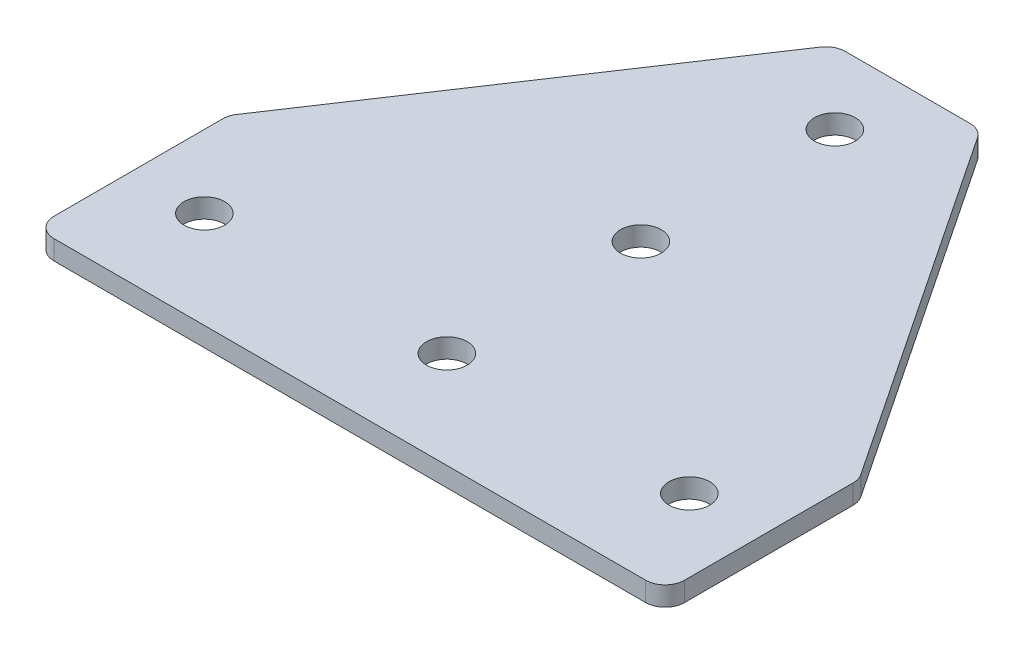
ISO-10303-21;
HEADER;
FILE_DESCRIPTION(('STEP AP214'),'2;1');
FILE_NAME('part.step','',(''),(''),'','','');
FILE_SCHEMA(('AUTOMOTIVE_DESIGN { 1 0 10303 214 1 1 1 1 }'));
ENDSEC;
DATA;
#1=APPLICATION_CONTEXT('core data for automotive mechanical design processes');
#2=APPLICATION_PROTOCOL_DEFINITION('international standard','automotive_design',2000,#1);
#3=PRODUCT_CONTEXT('',#1,'mechanical');
#4=PRODUCT('Part','Part','',(#3));
#5=PRODUCT_RELATED_PRODUCT_CATEGORY('part','',(#4));
#6=PRODUCT_DEFINITION_FORMATION('','',#4);
#7=PRODUCT_DEFINITION_CONTEXT('part definition',#1,'design');
#8=PRODUCT_DEFINITION('design','',#6,#7);
#9=PRODUCT_DEFINITION_SHAPE('','',#8);
#10=(LENGTH_UNIT() NAMED_UNIT(*) SI_UNIT(.MILLI.,.METRE.));
#11=(NAMED_UNIT(*) PLANE_ANGLE_UNIT() SI_UNIT($,.RADIAN.));
#12=(NAMED_UNIT(*) SI_UNIT($,.STERADIAN.) SOLID_ANGLE_UNIT());
#13=UNCERTAINTY_MEASURE_WITH_UNIT(LENGTH_MEASURE(1.E-05),#10,'distance_accuracy_value','');
#14=(GEOMETRIC_REPRESENTATION_CONTEXT(3) GLOBAL_UNCERTAINTY_ASSIGNED_CONTEXT((#13)) GLOBAL_UNIT_ASSIGNED_CONTEXT((#10,
#11,#12)) REPRESENTATION_CONTEXT('',''));
#15=CARTESIAN_POINT('',(0.,0.,0.));
#16=DIRECTION('',(0.,0.,1.));
#17=DIRECTION('',(1.,0.,0.));
#18=AXIS2_PLACEMENT_3D('',#15,#16,#17);
#19=CARTESIAN_POINT('',(0.,2.,0.));
#20=DIRECTION('',(0.,1.,0.));
#21=DIRECTION('',(0.,0.,1.));
#22=AXIS2_PLACEMENT_3D('',#19,#20,#21);
#23=PLANE('',#22);
#24=CARTESIAN_POINT('',(32.5,2.,-50.));
#25=DIRECTION('',(0.,1.,0.));
#26=DIRECTION('',(0.,0.,1.));
#27=AXIS2_PLACEMENT_3D('',#24,#25,#26);
#28=CIRCLE('',#27,2.1);
#29=CARTESIAN_POINT('',(32.5,2.,-47.9));
#30=VERTEX_POINT('',#29);
#31=EDGE_CURVE('E250',#30,#30,#28,.T.);
#32=ORIENTED_EDGE('',*,*,#31,.F.);
#33=EDGE_LOOP('',(#32));
#34=FACE_BOUND('',#33,.T.);
#35=CARTESIAN_POINT('',(57.5,2.,-10.));
#36=DIRECTION('',(0.,1.,0.));
#37=DIRECTION('',(0.,0.,-1.));
#38=AXIS2_PLACEMENT_3D('',#35,#36,#37);
#39=CIRCLE('',#38,2.1);
#40=CARTESIAN_POINT('',(57.5,2.,-12.1));
#41=VERTEX_POINT('',#40);
#42=EDGE_CURVE('E239',#41,#41,#39,.T.);
#43=ORIENTED_EDGE('',*,*,#42,.F.);
#44=EDGE_LOOP('',(#43));
#45=FACE_BOUND('',#44,.T.);
#46=DIRECTION('',(-0.554700196225229,0.,0.832050294337844));
#47=VECTOR('',#46,1.);
#48=CARTESIAN_POINT('',(25.,2.,-57.5));
#49=LINE('',#48,#47);
#50=CARTESIAN_POINT('',(24.4062669283003,2.,-56.6094003924505));
#51=VERTEX_POINT('',#50);
#52=CARTESIAN_POINT('',(0.335899411324305,2.,-20.5038491169865));
#53=VERTEX_POINT('',#52);
#54=EDGE_CURVE('E162',#51,#53,#49,.T.);
#55=ORIENTED_EDGE('',*,*,#54,.T.);
#56=CARTESIAN_POINT('',(2.,2.,-19.394448724536));
#57=DIRECTION('',(0.,1.,0.));
#58=DIRECTION('',(0.,0.,1.));
#59=AXIS2_PLACEMENT_3D('',#56,#57,#58);
#60=CIRCLE('',#59,2.);
#61=CARTESIAN_POINT('',(0.,2.,-19.394448724536));
#62=VERTEX_POINT('',#61);
#63=EDGE_CURVE('E195',#53,#62,#60,.T.);
#64=ORIENTED_EDGE('',*,*,#63,.T.);
#65=DIRECTION('',(0.,0.,1.));
#66=VECTOR('',#65,1.);
#67=CARTESIAN_POINT('',(0.,2.,-20.));
#68=LINE('',#67,#66);
#69=CARTESIAN_POINT('',(0.,2.,-2.));
#70=VERTEX_POINT('',#69);
#71=EDGE_CURVE('E145',#62,#70,#68,.T.);
#72=ORIENTED_EDGE('',*,*,#71,.T.);
#73=CARTESIAN_POINT('',(2.,2.,-2.));
#74=DIRECTION('',(0.,1.,0.));
#75=DIRECTION('',(0.,0.,1.));
#76=AXIS2_PLACEMENT_3D('',#73,#74,#75);
#77=CIRCLE('',#76,2.);
#78=CARTESIAN_POINT('',(2.,2.,0.));
#79=VERTEX_POINT('',#78);
#80=EDGE_CURVE('E193',#70,#79,#77,.T.);
#81=ORIENTED_EDGE('',*,*,#80,.T.);
#82=DIRECTION('',(1.,0.,0.));
#83=VECTOR('',#82,1.);
#84=CARTESIAN_POINT('',(0.,2.,0.));
#85=LINE('',#84,#83);
#86=CARTESIAN_POINT('',(63.,2.,0.));
#87=VERTEX_POINT('',#86);
#88=EDGE_CURVE('E234',#79,#87,#85,.T.);
#89=ORIENTED_EDGE('',*,*,#88,.T.);
#90=CARTESIAN_POINT('',(63.,2.,-2.));
#91=DIRECTION('',(0.,1.,0.));
#92=DIRECTION('',(0.,0.,1.));
#93=AXIS2_PLACEMENT_3D('',#90,#91,#92);
#94=CIRCLE('',#93,2.);
#95=CARTESIAN_POINT('',(65.,2.,-2.));
#96=VERTEX_POINT('',#95);
#97=EDGE_CURVE('E191',#87,#96,#94,.T.);
#98=ORIENTED_EDGE('',*,*,#97,.T.);
#99=DIRECTION('',(0.,0.,-1.));
#100=VECTOR('',#99,1.);
#101=CARTESIAN_POINT('',(65.,2.,0.));
#102=LINE('',#101,#100);
#103=CARTESIAN_POINT('',(65.,2.,-19.394448724536));
#104=VERTEX_POINT('',#103);
#105=EDGE_CURVE('E229',#96,#104,#102,.T.);
#106=ORIENTED_EDGE('',*,*,#105,.T.);
#107=CARTESIAN_POINT('',(63.,2.,-19.394448724536));
#108=DIRECTION('',(0.,1.,0.));
#109=DIRECTION('',(0.,0.,1.));
#110=AXIS2_PLACEMENT_3D('',#107,#108,#109);
#111=CIRCLE('',#110,2.);
#112=CARTESIAN_POINT('',(64.6641005886757,2.,-20.5038491169865));
#113=VERTEX_POINT('',#112);
#114=EDGE_CURVE('E189',#104,#113,#111,.T.);
#115=ORIENTED_EDGE('',*,*,#114,.T.);
#116=DIRECTION('',(-0.554700196225229,0.,-0.832050294337844));
#117=VECTOR('',#116,1.);
#118=CARTESIAN_POINT('',(65.,2.,-20.));
#119=LINE('',#118,#117);
#120=CARTESIAN_POINT('',(40.5937330716997,2.,-56.6094003924505));
#121=VERTEX_POINT('',#120);
#122=EDGE_CURVE('E217',#113,#121,#119,.T.);
#123=ORIENTED_EDGE('',*,*,#122,.T.);
#124=CARTESIAN_POINT('',(38.929632483024,2.,-55.5));
#125=DIRECTION('',(0.,1.,0.));
#126=DIRECTION('',(0.,0.,1.));
#127=AXIS2_PLACEMENT_3D('',#124,#125,#126);
#128=CIRCLE('',#127,2.);
#129=CARTESIAN_POINT('',(38.929632483024,2.,-57.5));
#130=VERTEX_POINT('',#129);
#131=EDGE_CURVE('E56',#121,#130,#128,.T.);
#132=ORIENTED_EDGE('',*,*,#131,.T.);
#133=DIRECTION('',(-1.,0.,0.));
#134=VECTOR('',#133,1.);
#135=CARTESIAN_POINT('',(40.,2.,-57.5));
#136=LINE('',#135,#134);
#137=CARTESIAN_POINT('',(26.070367516976,2.,-57.5));
#138=VERTEX_POINT('',#137);
#139=EDGE_CURVE('E226',#130,#138,#136,.T.);
#140=ORIENTED_EDGE('',*,*,#139,.T.);
#141=CARTESIAN_POINT('',(26.070367516976,2.,-55.5));
#142=DIRECTION('',(0.,1.,0.));
#143=DIRECTION('',(0.,0.,1.));
#144=AXIS2_PLACEMENT_3D('',#141,#142,#143);
#145=CIRCLE('',#144,2.);
#146=EDGE_CURVE('E186',#138,#51,#145,.T.);
#147=ORIENTED_EDGE('',*,*,#146,.T.);
#148=EDGE_LOOP('',(#55,#64,#72,#81,#89,#98,#106,#115,#123,#132,#140,#147));
#149=FACE_BOUND('',#148,.T.);
#150=CARTESIAN_POINT('',(7.5,2.,-10.));
#151=DIRECTION('',(0.,1.,0.));
#152=DIRECTION('',(0.,0.,1.));
#153=AXIS2_PLACEMENT_3D('',#150,#151,#152);
#154=CIRCLE('',#153,2.1);
#155=CARTESIAN_POINT('',(7.5,2.,-7.9));
#156=VERTEX_POINT('',#155);
#157=EDGE_CURVE('E153',#156,#156,#154,.T.);
#158=ORIENTED_EDGE('',*,*,#157,.F.);
#159=EDGE_LOOP('',(#158));
#160=FACE_BOUND('',#159,.T.);
#161=CARTESIAN_POINT('',(32.5,2.,-10.));
#162=DIRECTION('',(0.,1.,0.));
#163=DIRECTION('',(0.,0.,1.));
#164=AXIS2_PLACEMENT_3D('',#161,#162,#163);
#165=CIRCLE('',#164,2.1);
#166=CARTESIAN_POINT('',(32.5,2.,-7.9));
#167=VERTEX_POINT('',#166);
#168=EDGE_CURVE('E244',#167,#167,#165,.T.);
#169=ORIENTED_EDGE('',*,*,#168,.F.);
#170=EDGE_LOOP('',(#169));
#171=FACE_BOUND('',#170,.T.);
#172=CARTESIAN_POINT('',(32.5,2.,-30.));
#173=DIRECTION('',(0.,1.,0.));
#174=DIRECTION('',(0.,0.,1.));
#175=AXIS2_PLACEMENT_3D('',#172,#173,#174);
#176=CIRCLE('',#175,2.1);
#177=CARTESIAN_POINT('',(32.5,2.,-27.9));
#178=VERTEX_POINT('',#177);
#179=EDGE_CURVE('E256',#178,#178,#176,.T.);
#180=ORIENTED_EDGE('',*,*,#179,.F.);
#181=EDGE_LOOP('',(#180));
#182=FACE_BOUND('',#181,.T.);
#183=ADVANCED_FACE('F35',(#34,#45,#149,#160,#171,#182),#23,.T.);
#184=CARTESIAN_POINT('',(0.,0.,0.));
#185=DIRECTION('',(0.,1.,0.));
#186=DIRECTION('',(0.,0.,1.));
#187=AXIS2_PLACEMENT_3D('',#184,#185,#186);
#188=PLANE('',#187);
#189=DIRECTION('',(0.,0.,1.));
#190=VECTOR('',#189,1.);
#191=CARTESIAN_POINT('',(0.,0.,-20.));
#192=LINE('',#191,#190);
#193=CARTESIAN_POINT('',(0.,0.,-19.394448724536));
#194=VERTEX_POINT('',#193);
#195=CARTESIAN_POINT('',(0.,0.,-2.));
#196=VERTEX_POINT('',#195);
#197=EDGE_CURVE('E142',#194,#196,#192,.T.);
#198=ORIENTED_EDGE('',*,*,#197,.F.);
#199=CARTESIAN_POINT('',(2.,0.,-19.394448724536));
#200=DIRECTION('',(0.,1.,0.));
#201=DIRECTION('',(0.,0.,1.));
#202=AXIS2_PLACEMENT_3D('',#199,#200,#201);
#203=CIRCLE('',#202,2.);
#204=CARTESIAN_POINT('',(0.335899411324305,0.,-20.5038491169865));
#205=VERTEX_POINT('',#204);
#206=EDGE_CURVE('E125',#194,#205,#203,.F.);
#207=ORIENTED_EDGE('',*,*,#206,.T.);
#208=DIRECTION('',(-0.554700196225229,0.,0.832050294337844));
#209=VECTOR('',#208,1.);
#210=CARTESIAN_POINT('',(25.,0.,-57.5));
#211=LINE('',#210,#209);
#212=CARTESIAN_POINT('',(24.4062669283003,0.,-56.6094003924505));
#213=VERTEX_POINT('',#212);
#214=EDGE_CURVE('E172',#213,#205,#211,.T.);
#215=ORIENTED_EDGE('',*,*,#214,.F.);
#216=CARTESIAN_POINT('',(26.070367516976,0.,-55.5));
#217=DIRECTION('',(0.,1.,0.));
#218=DIRECTION('',(0.,0.,1.));
#219=AXIS2_PLACEMENT_3D('',#216,#217,#218);
#220=CIRCLE('',#219,2.);
#221=CARTESIAN_POINT('',(26.070367516976,0.,-57.5));
#222=VERTEX_POINT('',#221);
#223=EDGE_CURVE('E146',#213,#222,#220,.F.);
#224=ORIENTED_EDGE('',*,*,#223,.T.);
#225=DIRECTION('',(-1.,0.,0.));
#226=VECTOR('',#225,1.);
#227=CARTESIAN_POINT('',(40.,0.,-57.5));
#228=LINE('',#227,#226);
#229=CARTESIAN_POINT('',(38.929632483024,0.,-57.5));
#230=VERTEX_POINT('',#229);
#231=EDGE_CURVE('E170',#230,#222,#228,.T.);
#232=ORIENTED_EDGE('',*,*,#231,.F.);
#233=CARTESIAN_POINT('',(38.929632483024,0.,-55.5));
#234=DIRECTION('',(0.,1.,0.));
#235=DIRECTION('',(0.,0.,1.));
#236=AXIS2_PLACEMENT_3D('',#233,#234,#235);
#237=CIRCLE('',#236,2.);
#238=CARTESIAN_POINT('',(40.5937330716997,0.,-56.6094003924505));
#239=VERTEX_POINT('',#238);
#240=EDGE_CURVE('E176',#230,#239,#237,.F.);
#241=ORIENTED_EDGE('',*,*,#240,.T.);
#242=DIRECTION('',(-0.554700196225229,0.,-0.832050294337844));
#243=VECTOR('',#242,1.);
#244=CARTESIAN_POINT('',(65.,0.,-20.));
#245=LINE('',#244,#243);
#246=CARTESIAN_POINT('',(64.6641005886757,0.,-20.5038491169865));
#247=VERTEX_POINT('',#246);
#248=EDGE_CURVE('E167',#247,#239,#245,.T.);
#249=ORIENTED_EDGE('',*,*,#248,.F.);
#250=CARTESIAN_POINT('',(63.,0.,-19.394448724536));
#251=DIRECTION('',(0.,1.,0.));
#252=DIRECTION('',(0.,0.,1.));
#253=AXIS2_PLACEMENT_3D('',#250,#251,#252);
#254=CIRCLE('',#253,2.);
#255=CARTESIAN_POINT('',(65.,0.,-19.394448724536));
#256=VERTEX_POINT('',#255);
#257=EDGE_CURVE('E178',#247,#256,#254,.F.);
#258=ORIENTED_EDGE('',*,*,#257,.T.);
#259=DIRECTION('',(0.,0.,-1.));
#260=VECTOR('',#259,1.);
#261=CARTESIAN_POINT('',(65.,0.,0.));
#262=LINE('',#261,#260);
#263=CARTESIAN_POINT('',(65.,0.,-2.));
#264=VERTEX_POINT('',#263);
#265=EDGE_CURVE('E156',#264,#256,#262,.T.);
#266=ORIENTED_EDGE('',*,*,#265,.F.);
#267=CARTESIAN_POINT('',(63.,0.,-2.));
#268=DIRECTION('',(0.,1.,0.));
#269=DIRECTION('',(0.,0.,1.));
#270=AXIS2_PLACEMENT_3D('',#267,#268,#269);
#271=CIRCLE('',#270,2.);
#272=CARTESIAN_POINT('',(63.,0.,0.));
#273=VERTEX_POINT('',#272);
#274=EDGE_CURVE('E180',#264,#273,#271,.F.);
#275=ORIENTED_EDGE('',*,*,#274,.T.);
#276=DIRECTION('',(1.,0.,0.));
#277=VECTOR('',#276,1.);
#278=CARTESIAN_POINT('',(0.,0.,0.));
#279=LINE('',#278,#277);
#280=CARTESIAN_POINT('',(2.,0.,0.));
#281=VERTEX_POINT('',#280);
#282=EDGE_CURVE('E152',#281,#273,#279,.T.);
#283=ORIENTED_EDGE('',*,*,#282,.F.);
#284=CARTESIAN_POINT('',(2.,0.,-2.));
#285=DIRECTION('',(0.,1.,0.));
#286=DIRECTION('',(0.,0.,1.));
#287=AXIS2_PLACEMENT_3D('',#284,#285,#286);
#288=CIRCLE('',#287,2.);
#289=EDGE_CURVE('E136',#281,#196,#288,.F.);
#290=ORIENTED_EDGE('',*,*,#289,.T.);
#291=EDGE_LOOP('',(#198,#207,#215,#224,#232,#241,#249,#258,#266,#275,#283,#290));
#292=FACE_BOUND('',#291,.T.);
#293=CARTESIAN_POINT('',(7.5,0.,-10.));
#294=DIRECTION('',(0.,1.,0.));
#295=DIRECTION('',(0.,0.,1.));
#296=AXIS2_PLACEMENT_3D('',#293,#294,#295);
#297=CIRCLE('',#296,2.1);
#298=CARTESIAN_POINT('',(7.5,0.,-7.9));
#299=VERTEX_POINT('',#298);
#300=EDGE_CURVE('E159',#299,#299,#297,.T.);
#301=ORIENTED_EDGE('',*,*,#300,.T.);
#302=EDGE_LOOP('',(#301));
#303=FACE_BOUND('',#302,.T.);
#304=CARTESIAN_POINT('',(57.5,0.,-10.));
#305=DIRECTION('',(0.,1.,0.));
#306=DIRECTION('',(0.,0.,-1.));
#307=AXIS2_PLACEMENT_3D('',#304,#305,#306);
#308=CIRCLE('',#307,2.1);
#309=CARTESIAN_POINT('',(57.5,0.,-12.1));
#310=VERTEX_POINT('',#309);
#311=EDGE_CURVE('E241',#310,#310,#308,.T.);
#312=ORIENTED_EDGE('',*,*,#311,.T.);
#313=EDGE_LOOP('',(#312));
#314=FACE_BOUND('',#313,.T.);
#315=CARTESIAN_POINT('',(32.5,0.,-10.));
#316=DIRECTION('',(0.,1.,0.));
#317=DIRECTION('',(0.,0.,1.));
#318=AXIS2_PLACEMENT_3D('',#315,#316,#317);
#319=CIRCLE('',#318,2.1);
#320=CARTESIAN_POINT('',(32.5,0.,-7.9));
#321=VERTEX_POINT('',#320);
#322=EDGE_CURVE('E247',#321,#321,#319,.T.);
#323=ORIENTED_EDGE('',*,*,#322,.T.);
#324=EDGE_LOOP('',(#323));
#325=FACE_BOUND('',#324,.T.);
#326=CARTESIAN_POINT('',(32.5,0.,-50.));
#327=DIRECTION('',(0.,1.,0.));
#328=DIRECTION('',(0.,0.,1.));
#329=AXIS2_PLACEMENT_3D('',#326,#327,#328);
#330=CIRCLE('',#329,2.1);
#331=CARTESIAN_POINT('',(32.5,0.,-47.9));
#332=VERTEX_POINT('',#331);
#333=EDGE_CURVE('E253',#332,#332,#330,.T.);
#334=ORIENTED_EDGE('',*,*,#333,.T.);
#335=EDGE_LOOP('',(#334));
#336=FACE_BOUND('',#335,.T.);
#337=CARTESIAN_POINT('',(32.5,0.,-30.));
#338=DIRECTION('',(0.,1.,0.));
#339=DIRECTION('',(0.,0.,1.));
#340=AXIS2_PLACEMENT_3D('',#337,#338,#339);
#341=CIRCLE('',#340,2.1);
#342=CARTESIAN_POINT('',(32.5,0.,-27.9));
#343=VERTEX_POINT('',#342);
#344=EDGE_CURVE('E259',#343,#343,#341,.T.);
#345=ORIENTED_EDGE('',*,*,#344,.T.);
#346=EDGE_LOOP('',(#345));
#347=FACE_BOUND('',#346,.T.);
#348=ADVANCED_FACE('F149',(#292,#303,#314,#325,#336,#347),#188,.F.);
#349=CARTESIAN_POINT('',(0.,2.,-20.));
#350=DIRECTION('',(1.,0.,0.));
#351=DIRECTION('',(0.,0.,-1.));
#352=AXIS2_PLACEMENT_3D('',#349,#350,#351);
#353=PLANE('',#352);
#354=ORIENTED_EDGE('',*,*,#71,.F.);
#355=DIRECTION('',(0.,-1.,0.));
#356=VECTOR('',#355,1.);
#357=CARTESIAN_POINT('',(0.,2.,-19.394448724536));
#358=LINE('',#357,#356);
#359=EDGE_CURVE('E129',#62,#194,#358,.T.);
#360=ORIENTED_EDGE('',*,*,#359,.T.);
#361=ORIENTED_EDGE('',*,*,#197,.T.);
#362=DIRECTION('',(0.,-1.,0.));
#363=VECTOR('',#362,1.);
#364=CARTESIAN_POINT('',(0.,2.,-2.));
#365=LINE('',#364,#363);
#366=EDGE_CURVE('E147',#196,#70,#365,.F.);
#367=ORIENTED_EDGE('',*,*,#366,.T.);
#368=EDGE_LOOP('',(#354,#360,#361,#367));
#369=FACE_BOUND('',#368,.T.);
#370=ADVANCED_FACE('F141',(#369),#353,.F.);
#371=CARTESIAN_POINT('',(0.,2.,0.));
#372=DIRECTION('',(0.,0.,-1.));
#373=DIRECTION('',(-1.,0.,0.));
#374=AXIS2_PLACEMENT_3D('',#371,#372,#373);
#375=PLANE('',#374);
#376=ORIENTED_EDGE('',*,*,#88,.F.);
#377=DIRECTION('',(0.,-1.,0.));
#378=VECTOR('',#377,1.);
#379=CARTESIAN_POINT('',(2.,2.,0.));
#380=LINE('',#379,#378);
#381=EDGE_CURVE('E199',#79,#281,#380,.T.);
#382=ORIENTED_EDGE('',*,*,#381,.T.);
#383=ORIENTED_EDGE('',*,*,#282,.T.);
#384=DIRECTION('',(0.,-1.,0.));
#385=VECTOR('',#384,1.);
#386=CARTESIAN_POINT('',(63.,2.,0.));
#387=LINE('',#386,#385);
#388=EDGE_CURVE('E197',#273,#87,#387,.F.);
#389=ORIENTED_EDGE('',*,*,#388,.T.);
#390=EDGE_LOOP('',(#376,#382,#383,#389));
#391=FACE_BOUND('',#390,.T.);
#392=ADVANCED_FACE('F292',(#391),#375,.F.);
#393=CARTESIAN_POINT('',(65.,2.,0.));
#394=DIRECTION('',(-1.,0.,0.));
#395=DIRECTION('',(0.,0.,1.));
#396=AXIS2_PLACEMENT_3D('',#393,#394,#395);
#397=PLANE('',#396);
#398=ORIENTED_EDGE('',*,*,#105,.F.);
#399=DIRECTION('',(0.,-1.,0.));
#400=VECTOR('',#399,1.);
#401=CARTESIAN_POINT('',(65.,2.,-2.));
#402=LINE('',#401,#400);
#403=EDGE_CURVE('E204',#96,#264,#402,.T.);
#404=ORIENTED_EDGE('',*,*,#403,.T.);
#405=ORIENTED_EDGE('',*,*,#265,.T.);
#406=DIRECTION('',(0.,-1.,0.));
#407=VECTOR('',#406,1.);
#408=CARTESIAN_POINT('',(65.,2.,-19.394448724536));
#409=LINE('',#408,#407);
#410=EDGE_CURVE('E202',#256,#104,#409,.F.);
#411=ORIENTED_EDGE('',*,*,#410,.T.);
#412=EDGE_LOOP('',(#398,#404,#405,#411));
#413=FACE_BOUND('',#412,.T.);
#414=ADVANCED_FACE('F289',(#413),#397,.F.);
#415=CARTESIAN_POINT('',(65.,2.,-20.));
#416=DIRECTION('',(-0.832050294337844,0.,0.554700196225229));
#417=DIRECTION('',(0.554700196225229,0.,0.832050294337844));
#418=AXIS2_PLACEMENT_3D('',#415,#416,#417);
#419=PLANE('',#418);
#420=ORIENTED_EDGE('',*,*,#122,.F.);
#421=DIRECTION('',(0.,-1.,0.));
#422=VECTOR('',#421,1.);
#423=CARTESIAN_POINT('',(64.6641005886757,2.,-20.5038491169865));
#424=LINE('',#423,#422);
#425=EDGE_CURVE('E209',#113,#247,#424,.T.);
#426=ORIENTED_EDGE('',*,*,#425,.T.);
#427=ORIENTED_EDGE('',*,*,#248,.T.);
#428=DIRECTION('',(0.,-1.,0.));
#429=VECTOR('',#428,1.);
#430=CARTESIAN_POINT('',(40.5937330716997,2.,-56.6094003924505));
#431=LINE('',#430,#429);
#432=EDGE_CURVE('E207',#239,#121,#431,.F.);
#433=ORIENTED_EDGE('',*,*,#432,.T.);
#434=EDGE_LOOP('',(#420,#426,#427,#433));
#435=FACE_BOUND('',#434,.T.);
#436=ADVANCED_FACE('F215',(#435),#419,.F.);
#437=CARTESIAN_POINT('',(40.,2.,-57.5));
#438=DIRECTION('',(0.,0.,1.));
#439=DIRECTION('',(1.,0.,0.));
#440=AXIS2_PLACEMENT_3D('',#437,#438,#439);
#441=PLANE('',#440);
#442=ORIENTED_EDGE('',*,*,#139,.F.);
#443=DIRECTION('',(0.,-1.,0.));
#444=VECTOR('',#443,1.);
#445=CARTESIAN_POINT('',(38.929632483024,2.,-57.5));
#446=LINE('',#445,#444);
#447=EDGE_CURVE('E11',#130,#230,#446,.T.);
#448=ORIENTED_EDGE('',*,*,#447,.T.);
#449=ORIENTED_EDGE('',*,*,#231,.T.);
#450=DIRECTION('',(0.,-1.,0.));
#451=VECTOR('',#450,1.);
#452=CARTESIAN_POINT('',(26.070367516976,2.,-57.5));
#453=LINE('',#452,#451);
#454=EDGE_CURVE('E43',#222,#138,#453,.F.);
#455=ORIENTED_EDGE('',*,*,#454,.T.);
#456=EDGE_LOOP('',(#442,#448,#449,#455));
#457=FACE_BOUND('',#456,.T.);
#458=ADVANCED_FACE('F225',(#457),#441,.F.);
#459=CARTESIAN_POINT('',(25.,2.,-57.5));
#460=DIRECTION('',(0.832050294337844,0.,0.554700196225229));
#461=DIRECTION('',(0.554700196225229,0.,-0.832050294337844));
#462=AXIS2_PLACEMENT_3D('',#459,#460,#461);
#463=PLANE('',#462);
#464=ORIENTED_EDGE('',*,*,#214,.T.);
#465=DIRECTION('',(0.,-1.,0.));
#466=VECTOR('',#465,1.);
#467=CARTESIAN_POINT('',(0.335899411324312,2.,-20.5038491169865));
#468=LINE('',#467,#466);
#469=EDGE_CURVE('E130',#205,#53,#468,.F.);
#470=ORIENTED_EDGE('',*,*,#469,.T.);
#471=ORIENTED_EDGE('',*,*,#54,.F.);
#472=DIRECTION('',(0.,-1.,0.));
#473=VECTOR('',#472,1.);
#474=CARTESIAN_POINT('',(24.4062669283003,2.,-56.6094003924505));
#475=LINE('',#474,#473);
#476=EDGE_CURVE('E135',#51,#213,#475,.T.);
#477=ORIENTED_EDGE('',*,*,#476,.T.);
#478=EDGE_LOOP('',(#464,#470,#471,#477));
#479=FACE_BOUND('',#478,.T.);
#480=ADVANCED_FACE('F281',(#479),#463,.F.);
#481=CARTESIAN_POINT('',(7.5,2.,-10.));
#482=DIRECTION('',(0.,-1.,0.));
#483=DIRECTION('',(0.,0.,-1.));
#484=AXIS2_PLACEMENT_3D('',#481,#482,#483);
#485=CYLINDRICAL_SURFACE('',#484,2.1);
#486=ORIENTED_EDGE('',*,*,#157,.T.);
#487=EDGE_LOOP('',(#486));
#488=FACE_BOUND('',#487,.T.);
#489=ORIENTED_EDGE('',*,*,#300,.F.);
#490=EDGE_LOOP('',(#489));
#491=FACE_BOUND('',#490,.T.);
#492=ADVANCED_FACE('F278',(#488,#491),#485,.F.);
#493=CARTESIAN_POINT('',(57.5,2.,-10.));
#494=DIRECTION('',(0.,-1.,0.));
#495=DIRECTION('',(0.,0.,-1.));
#496=AXIS2_PLACEMENT_3D('',#493,#494,#495);
#497=CYLINDRICAL_SURFACE('',#496,2.1);
#498=ORIENTED_EDGE('',*,*,#42,.T.);
#499=EDGE_LOOP('',(#498));
#500=FACE_BOUND('',#499,.T.);
#501=ORIENTED_EDGE('',*,*,#311,.F.);
#502=EDGE_LOOP('',(#501));
#503=FACE_BOUND('',#502,.T.);
#504=ADVANCED_FACE('F337',(#500,#503),#497,.F.);
#505=CARTESIAN_POINT('',(32.5,2.,-10.));
#506=DIRECTION('',(0.,-1.,0.));
#507=DIRECTION('',(0.,0.,-1.));
#508=AXIS2_PLACEMENT_3D('',#505,#506,#507);
#509=CYLINDRICAL_SURFACE('',#508,2.1);
#510=ORIENTED_EDGE('',*,*,#168,.T.);
#511=EDGE_LOOP('',(#510));
#512=FACE_BOUND('',#511,.T.);
#513=ORIENTED_EDGE('',*,*,#322,.F.);
#514=EDGE_LOOP('',(#513));
#515=FACE_BOUND('',#514,.T.);
#516=ADVANCED_FACE('F333',(#512,#515),#509,.F.);
#517=CARTESIAN_POINT('',(32.5,2.,-50.));
#518=DIRECTION('',(0.,-1.,0.));
#519=DIRECTION('',(0.,0.,-1.));
#520=AXIS2_PLACEMENT_3D('',#517,#518,#519);
#521=CYLINDRICAL_SURFACE('',#520,2.1);
#522=ORIENTED_EDGE('',*,*,#31,.T.);
#523=EDGE_LOOP('',(#522));
#524=FACE_BOUND('',#523,.T.);
#525=ORIENTED_EDGE('',*,*,#333,.F.);
#526=EDGE_LOOP('',(#525));
#527=FACE_BOUND('',#526,.T.);
#528=ADVANCED_FACE('F336',(#524,#527),#521,.F.);
#529=CARTESIAN_POINT('',(32.5,2.,-30.));
#530=DIRECTION('',(0.,-1.,0.));
#531=DIRECTION('',(0.,0.,-1.));
#532=AXIS2_PLACEMENT_3D('',#529,#530,#531);
#533=CYLINDRICAL_SURFACE('',#532,2.1);
#534=ORIENTED_EDGE('',*,*,#179,.T.);
#535=EDGE_LOOP('',(#534));
#536=FACE_BOUND('',#535,.T.);
#537=ORIENTED_EDGE('',*,*,#344,.F.);
#538=EDGE_LOOP('',(#537));
#539=FACE_BOUND('',#538,.T.);
#540=ADVANCED_FACE('F265',(#536,#539),#533,.F.);
#541=CARTESIAN_POINT('',(2.,2.,-19.394448724536));
#542=DIRECTION('',(0.,-1.,0.));
#543=DIRECTION('',(0.,0.,-1.));
#544=AXIS2_PLACEMENT_3D('',#541,#542,#543);
#545=CYLINDRICAL_SURFACE('',#544,2.);
#546=ORIENTED_EDGE('',*,*,#63,.F.);
#547=ORIENTED_EDGE('',*,*,#469,.F.);
#548=ORIENTED_EDGE('',*,*,#206,.F.);
#549=ORIENTED_EDGE('',*,*,#359,.F.);
#550=EDGE_LOOP('',(#546,#547,#548,#549));
#551=FACE_BOUND('',#550,.T.);
#552=ADVANCED_FACE('F128',(#551),#545,.T.);
#553=CARTESIAN_POINT('',(2.,2.,-2.));
#554=DIRECTION('',(0.,-1.,0.));
#555=DIRECTION('',(0.,0.,-1.));
#556=AXIS2_PLACEMENT_3D('',#553,#554,#555);
#557=CYLINDRICAL_SURFACE('',#556,2.);
#558=ORIENTED_EDGE('',*,*,#80,.F.);
#559=ORIENTED_EDGE('',*,*,#366,.F.);
#560=ORIENTED_EDGE('',*,*,#289,.F.);
#561=ORIENTED_EDGE('',*,*,#381,.F.);
#562=EDGE_LOOP('',(#558,#559,#560,#561));
#563=FACE_BOUND('',#562,.T.);
#564=ADVANCED_FACE('F301',(#563),#557,.T.);
#565=CARTESIAN_POINT('',(63.,2.,-2.));
#566=DIRECTION('',(0.,-1.,0.));
#567=DIRECTION('',(0.,0.,-1.));
#568=AXIS2_PLACEMENT_3D('',#565,#566,#567);
#569=CYLINDRICAL_SURFACE('',#568,2.);
#570=ORIENTED_EDGE('',*,*,#97,.F.);
#571=ORIENTED_EDGE('',*,*,#388,.F.);
#572=ORIENTED_EDGE('',*,*,#274,.F.);
#573=ORIENTED_EDGE('',*,*,#403,.F.);
#574=EDGE_LOOP('',(#570,#571,#572,#573));
#575=FACE_BOUND('',#574,.T.);
#576=ADVANCED_FACE('F304',(#575),#569,.T.);
#577=CARTESIAN_POINT('',(63.,2.,-19.394448724536));
#578=DIRECTION('',(0.,-1.,0.));
#579=DIRECTION('',(0.,0.,-1.));
#580=AXIS2_PLACEMENT_3D('',#577,#578,#579);
#581=CYLINDRICAL_SURFACE('',#580,2.);
#582=ORIENTED_EDGE('',*,*,#114,.F.);
#583=ORIENTED_EDGE('',*,*,#410,.F.);
#584=ORIENTED_EDGE('',*,*,#257,.F.);
#585=ORIENTED_EDGE('',*,*,#425,.F.);
#586=EDGE_LOOP('',(#582,#583,#584,#585));
#587=FACE_BOUND('',#586,.T.);
#588=ADVANCED_FACE('F308',(#587),#581,.T.);
#589=CARTESIAN_POINT('',(38.929632483024,2.,-55.5));
#590=DIRECTION('',(0.,-1.,0.));
#591=DIRECTION('',(0.,0.,-1.));
#592=AXIS2_PLACEMENT_3D('',#589,#590,#591);
#593=CYLINDRICAL_SURFACE('',#592,2.);
#594=ORIENTED_EDGE('',*,*,#131,.F.);
#595=ORIENTED_EDGE('',*,*,#432,.F.);
#596=ORIENTED_EDGE('',*,*,#240,.F.);
#597=ORIENTED_EDGE('',*,*,#447,.F.);
#598=EDGE_LOOP('',(#594,#595,#596,#597));
#599=FACE_BOUND('',#598,.T.);
#600=ADVANCED_FACE('F224',(#599),#593,.T.);
#601=CARTESIAN_POINT('',(26.070367516976,2.,-55.5));
#602=DIRECTION('',(0.,-1.,0.));
#603=DIRECTION('',(0.,0.,-1.));
#604=AXIS2_PLACEMENT_3D('',#601,#602,#603);
#605=CYLINDRICAL_SURFACE('',#604,2.);
#606=ORIENTED_EDGE('',*,*,#146,.F.);
#607=ORIENTED_EDGE('',*,*,#454,.F.);
#608=ORIENTED_EDGE('',*,*,#223,.F.);
#609=ORIENTED_EDGE('',*,*,#476,.F.);
#610=EDGE_LOOP('',(#606,#607,#608,#609));
#611=FACE_BOUND('',#610,.T.);
#612=ADVANCED_FACE('F37',(#611),#605,.T.);
#613=CLOSED_SHELL('',(#183,#348,#370,#392,#414,#436,#458,#480,#492,#504,#516,#528,#540,#552,
#564,#576,#588,#600,#612));
#614=MANIFOLD_SOLID_BREP('B2',#613);
#615=ADVANCED_BREP_SHAPE_REPRESENTATION('',(#18,#614),#14);
#616=SHAPE_DEFINITION_REPRESENTATION(#9,#615);
ENDSEC;
END-ISO-10303-21;
